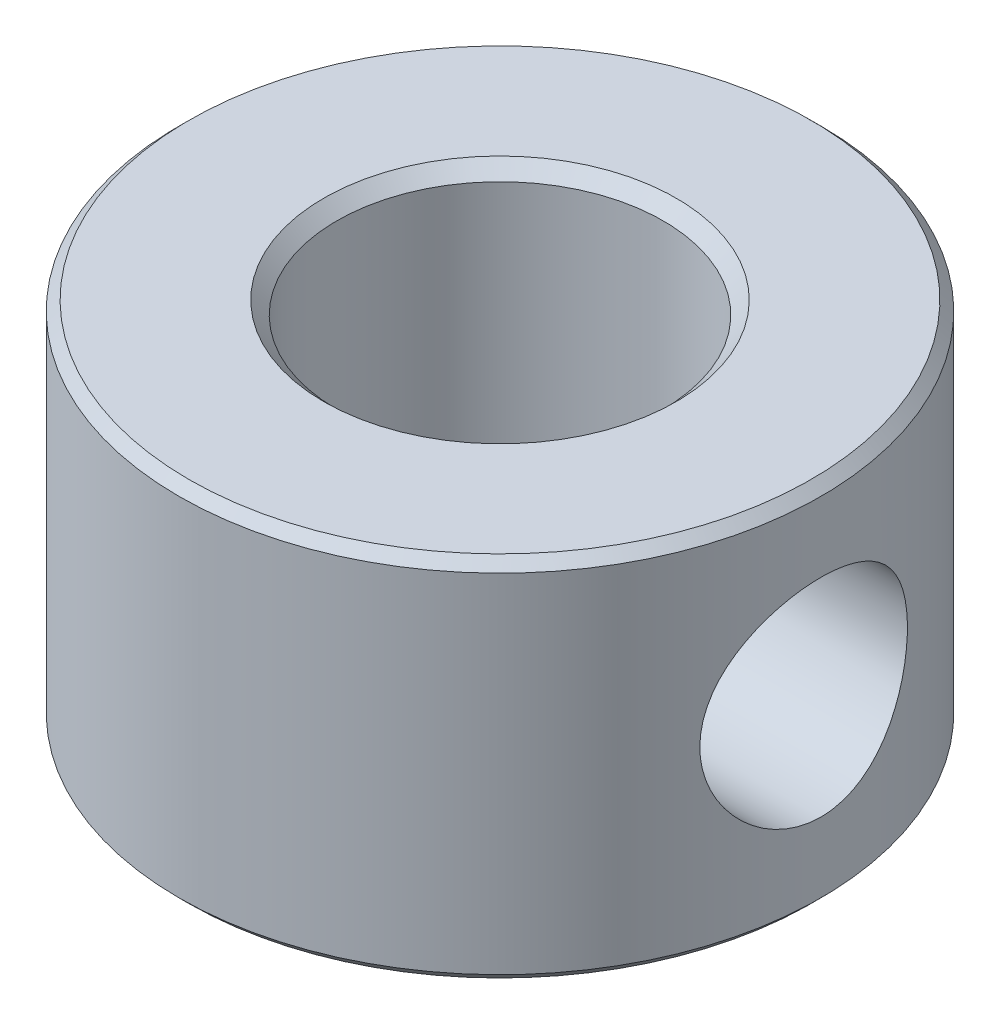
ISO-10303-21;
HEADER;
FILE_DESCRIPTION(('STEP AP214'),'2;1');
FILE_NAME('part.step','',(''),(''),'','','');
FILE_SCHEMA(('AUTOMOTIVE_DESIGN { 1 0 10303 214 1 1 1 1 }'));
ENDSEC;
DATA;
#1=APPLICATION_CONTEXT('core data for automotive mechanical design processes');
#2=APPLICATION_PROTOCOL_DEFINITION('international standard','automotive_design',2000,#1);
#3=PRODUCT_CONTEXT('',#1,'mechanical');
#4=PRODUCT('Part','Part','',(#3));
#5=PRODUCT_RELATED_PRODUCT_CATEGORY('part','',(#4));
#6=PRODUCT_DEFINITION_FORMATION('','',#4);
#7=PRODUCT_DEFINITION_CONTEXT('part definition',#1,'design');
#8=PRODUCT_DEFINITION('design','',#6,#7);
#9=PRODUCT_DEFINITION_SHAPE('','',#8);
#10=(LENGTH_UNIT() NAMED_UNIT(*) SI_UNIT(.MILLI.,.METRE.));
#11=(NAMED_UNIT(*) PLANE_ANGLE_UNIT() SI_UNIT($,.RADIAN.));
#12=(NAMED_UNIT(*) SI_UNIT($,.STERADIAN.) SOLID_ANGLE_UNIT());
#13=UNCERTAINTY_MEASURE_WITH_UNIT(LENGTH_MEASURE(1.E-05),#10,'distance_accuracy_value','');
#14=(GEOMETRIC_REPRESENTATION_CONTEXT(3) GLOBAL_UNCERTAINTY_ASSIGNED_CONTEXT((#13)) GLOBAL_UNIT_ASSIGNED_CONTEXT((#10,
#11,#12)) REPRESENTATION_CONTEXT('',''));
#15=CARTESIAN_POINT('',(0.,0.,0.));
#16=DIRECTION('',(0.,0.,1.));
#17=DIRECTION('',(1.,0.,0.));
#18=AXIS2_PLACEMENT_3D('',#15,#16,#17);
#19=CARTESIAN_POINT('',(0.,7.14502,0.));
#20=DIRECTION('',(0.,1.,0.));
#21=DIRECTION('',(0.,0.,1.));
#22=AXIS2_PLACEMENT_3D('',#19,#20,#21);
#23=PLANE('',#22);
#24=CARTESIAN_POINT('',(0.,7.14502,0.));
#25=DIRECTION('',(0.,1.,0.));
#26=DIRECTION('',(0.,0.,1.));
#27=AXIS2_PLACEMENT_3D('',#24,#25,#26);
#28=CIRCLE('',#27,3.429);
#29=CARTESIAN_POINT('',(0.,7.14502,3.429));
#30=VERTEX_POINT('',#29);
#31=EDGE_CURVE('E50',#30,#30,#28,.F.);
#32=ORIENTED_EDGE('',*,*,#31,.T.);
#33=EDGE_LOOP('',(#32));
#34=FACE_BOUND('',#33,.T.);
#35=CARTESIAN_POINT('',(0.,7.14502,0.));
#36=DIRECTION('',(0.,1.,0.));
#37=DIRECTION('',(0.,0.,1.));
#38=AXIS2_PLACEMENT_3D('',#35,#36,#37);
#39=CIRCLE('',#38,6.05155000000001);
#40=CARTESIAN_POINT('',(0.,7.14502,6.05155000000001));
#41=VERTEX_POINT('',#40);
#42=EDGE_CURVE('E62',#41,#41,#39,.T.);
#43=ORIENTED_EDGE('',*,*,#42,.T.);
#44=EDGE_LOOP('',(#43));
#45=FACE_BOUND('',#44,.T.);
#46=ADVANCED_FACE('F34',(#34,#45),#23,.T.);
#47=CARTESIAN_POINT('',(0.,0.,0.));
#48=DIRECTION('',(0.,1.,0.));
#49=DIRECTION('',(0.,0.,1.));
#50=AXIS2_PLACEMENT_3D('',#47,#48,#49);
#51=PLANE('',#50);
#52=CARTESIAN_POINT('',(0.,0.,0.));
#53=DIRECTION('',(0.,1.,0.));
#54=DIRECTION('',(0.,0.,1.));
#55=AXIS2_PLACEMENT_3D('',#52,#53,#54);
#56=CIRCLE('',#55,3.42899999999999);
#57=CARTESIAN_POINT('',(0.,0.,3.42899999999999));
#58=VERTEX_POINT('',#57);
#59=EDGE_CURVE('E46',#58,#58,#56,.T.);
#60=ORIENTED_EDGE('',*,*,#59,.T.);
#61=EDGE_LOOP('',(#60));
#62=FACE_BOUND('',#61,.T.);
#63=CARTESIAN_POINT('',(0.,0.,0.));
#64=DIRECTION('',(0.,1.,0.));
#65=DIRECTION('',(0.,0.,1.));
#66=AXIS2_PLACEMENT_3D('',#63,#64,#65);
#67=CIRCLE('',#66,6.05154999999999);
#68=CARTESIAN_POINT('',(0.,0.,6.05154999999999));
#69=VERTEX_POINT('',#68);
#70=EDGE_CURVE('E65',#69,#69,#67,.F.);
#71=ORIENTED_EDGE('',*,*,#70,.T.);
#72=EDGE_LOOP('',(#71));
#73=FACE_BOUND('',#72,.T.);
#74=ADVANCED_FACE('F95',(#62,#73),#51,.F.);
#75=CARTESIAN_POINT('',(0.,7.14502,0.));
#76=DIRECTION('',(0.,-1.,0.));
#77=DIRECTION('',(0.,0.,-1.));
#78=AXIS2_PLACEMENT_3D('',#75,#76,#77);
#79=CYLINDRICAL_SURFACE('',#78,6.24205);
#80=CARTESIAN_POINT('',(6.24205,1.55321000000001,0.));
#81=CARTESIAN_POINT('',(6.24204987098175,1.55321010305949,0.110361607787844));
#82=CARTESIAN_POINT('',(6.2390958556555,1.56228707806343,0.220725250071233));
#83=CARTESIAN_POINT('',(6.22760191806045,1.59825170997894,0.43821286009597));
#84=CARTESIAN_POINT('',(6.21906109093358,1.62514225204233,0.545336300102706));
#85=CARTESIAN_POINT('',(6.19732396104721,1.69572360172864,0.753176327739559));
#86=CARTESIAN_POINT('',(6.18413516935356,1.73938731425837,0.853902944457347));
#87=CARTESIAN_POINT('',(6.15445572442031,1.84215651905202,1.04660424357037));
#88=CARTESIAN_POINT('',(6.13796448104393,1.90126477177849,1.13857735740495));
#89=CARTESIAN_POINT('',(6.10281698787693,2.03528655688525,1.31418213372415));
#90=CARTESIAN_POINT('',(6.08411109688674,2.11061619914058,1.39748623675391));
#91=CARTESIAN_POINT('',(6.04692251587769,2.27405714507101,1.55052602599469));
#92=CARTESIAN_POINT('',(6.02843987198791,2.36217104299494,1.62025895152977));
#93=CARTESIAN_POINT('',(5.99325079912104,2.55157379256864,1.74600156347859));
#94=CARTESIAN_POINT('',(5.97660524073269,2.65315242483614,1.80159342593578));
#95=CARTESIAN_POINT('',(5.94772589089101,2.86484265778281,1.89476693037713));
#96=CARTESIAN_POINT('',(5.93549084231211,2.97495181612178,1.93235370534908));
#97=CARTESIAN_POINT('',(5.91733885565084,3.1968659604572,1.98723572400281));
#98=CARTESIAN_POINT('',(5.91123225336117,3.30850390708536,2.00514185100346));
#99=CARTESIAN_POINT('',(5.90546653592937,3.53335370137909,2.02206344905887));
#100=CARTESIAN_POINT('',(5.90580556391969,3.64656508637492,2.02108436059574));
#101=CARTESIAN_POINT('',(5.91272601191444,3.86621428099793,2.00073929260716));
#102=CARTESIAN_POINT('',(5.91904017316428,3.9727348633256,1.98216048494432));
#103=CARTESIAN_POINT('',(5.9367636319365,4.18105715713211,1.92842373887578));
#104=CARTESIAN_POINT('',(5.94817350644599,4.28285833279176,1.89326392297893));
#105=CARTESIAN_POINT('',(5.9750000638336,4.48068193047347,1.80682863570085));
#106=CARTESIAN_POINT('',(5.99047575426177,4.57659119538614,1.75531328608411));
#107=CARTESIAN_POINT('',(6.02366439491423,4.75865725871121,1.63779580184213));
#108=CARTESIAN_POINT('',(6.04137796011666,4.8448113639737,1.57178968139509));
#109=CARTESIAN_POINT('',(6.07810787944163,5.00935790224419,1.42334436695478));
#110=CARTESIAN_POINT('',(6.09714554601541,5.087163384294,1.34025857265405));
#111=CARTESIAN_POINT('',(6.13361656052184,5.22788482665606,1.16198264310722));
#112=CARTESIAN_POINT('',(6.15104977188977,5.29079952023982,1.06679147914057));
#113=CARTESIAN_POINT('',(6.1825538765581,5.40038974788208,0.86581670750765));
#114=CARTESIAN_POINT('',(6.19659358003453,5.44691631679446,0.759946647618174));
#115=CARTESIAN_POINT('',(6.21950303570453,5.52132121703144,0.54132106343912));
#116=CARTESIAN_POINT('',(6.22837447493545,5.54920563401166,0.428567799274002));
#117=CARTESIAN_POINT('',(6.23967218609234,5.58451406338999,0.204351750125743));
#118=CARTESIAN_POINT('',(6.24234836669601,5.59273188950391,0.0930263876335407));
#119=CARTESIAN_POINT('',(6.24169855806503,5.59072404152825,-0.129429578308453));
#120=CARTESIAN_POINT('',(6.23837351593071,5.58050127769389,-0.24056020971978));
#121=CARTESIAN_POINT('',(6.2262595122325,5.54253510603896,-0.456350285277136));
#122=CARTESIAN_POINT('',(6.21762037114401,5.51527179391414,-0.561103426418709));
#123=CARTESIAN_POINT('',(6.19590024482501,5.44459174553279,-0.76451293236808));
#124=CARTESIAN_POINT('',(6.18281870057258,5.40117297624445,-0.863168528026936));
#125=CARTESIAN_POINT('',(6.15313628841962,5.29818576054547,-1.05437511503154));
#126=CARTESIAN_POINT('',(6.13645440765245,5.23823482283847,-1.14670716032191));
#127=CARTESIAN_POINT('',(6.10147076745199,5.10433888852933,-1.3202626868448));
#128=CARTESIAN_POINT('',(6.08316854016024,5.03038984305611,-1.40148294231827));
#129=CARTESIAN_POINT('',(6.04602084377535,4.86686240241354,-1.5541099164561));
#130=CARTESIAN_POINT('',(6.02718549622144,4.77675194292228,-1.62495036869059));
#131=CARTESIAN_POINT('',(5.99190961061176,4.5855150744732,-1.75056523990495));
#132=CARTESIAN_POINT('',(5.97546906232882,4.48438871256282,-1.80533972749672));
#133=CARTESIAN_POINT('',(5.94701677031808,4.27407660655124,-1.89696824379646));
#134=CARTESIAN_POINT('',(5.93499183150095,4.16491606411411,-1.93387577102216));
#135=CARTESIAN_POINT('',(5.91687128549093,3.94145533762214,-1.9886353446116));
#136=CARTESIAN_POINT('',(5.91077320968064,3.82715731416885,-2.00649532483426));
#137=CARTESIAN_POINT('',(5.90546645058777,3.60262049145591,-2.02205698074767));
#138=CARTESIAN_POINT('',(5.90593835750382,3.49245325204258,-2.02069320679469));
#139=CARTESIAN_POINT('',(5.9129352562404,3.27400282004023,-2.00012503239849));
#140=CARTESIAN_POINT('',(5.91945992647479,3.1657195276676,-1.98092157978566));
#141=CARTESIAN_POINT('',(5.93759622909786,2.95591379377526,-1.92586390591926));
#142=CARTESIAN_POINT('',(5.94912038733202,2.85430823093395,-1.89029539712448));
#143=CARTESIAN_POINT('',(5.97592952606043,2.65842730062317,-1.80374539537514));
#144=CARTESIAN_POINT('',(5.99121530918817,2.56415350322009,-1.75276061245461));
#145=CARTESIAN_POINT('',(6.02461663149163,2.38137369030562,-1.63435334289241));
#146=CARTESIAN_POINT('',(6.04282328770591,2.29326947134838,-1.56633643673177));
#147=CARTESIAN_POINT('',(6.07961581104668,2.12942305747808,-1.41682013012052));
#148=CARTESIAN_POINT('',(6.0982017813197,2.05368427686617,-1.33531701837245));
#149=CARTESIAN_POINT('',(6.13445933896264,1.9139875328968,-1.15762581730249));
#150=CARTESIAN_POINT('',(6.15207416705775,1.85054995408412,-1.06101566124169));
#151=CARTESIAN_POINT('',(6.18366159886644,1.74089240857486,-0.85793612079198));
#152=CARTESIAN_POINT('',(6.19763537745447,1.69466688591308,-0.751469931761009));
#153=CARTESIAN_POINT('',(6.21962033037372,1.62337240261327,-0.538709548099766));
#154=CARTESIAN_POINT('',(6.22795509697885,1.59714160143855,-0.43283792917931));
#155=CARTESIAN_POINT('',(6.23916934417463,1.56206242459734,-0.217977701178107));
#156=CARTESIAN_POINT('',(6.24205012741459,1.55320989822154,-0.108989842705757));
#157=CARTESIAN_POINT('',(6.24205,1.55321000000001,0.));
#158=B_SPLINE_CURVE_WITH_KNOTS('',3,(#80,#81,#82,#83,#84,#85,#86,#87,#88,#89,#90,#91,#92,#93,
#94,#95,#96,#97,#98,#99,#100,#101,#102,#103,#104,#105,#106,#107,#108,#109,#110,#111,#112,#113,
#114,#115,#116,#117,#118,#119,#120,#121,#122,#123,#124,#125,#126,#127,#128,#129,#130,#131,#132,
#133,#134,#135,#136,#137,#138,#139,#140,#141,#142,#143,#144,#145,#146,#147,#148,#149,#150,#151,
#152,#153,#154,#155,#156,#157),.UNSPECIFIED.,.T.,.F.,(4,2,2,2,2,2,2,2,2,2,2,2,2,2,2,2,2,2,2,2,2,
2,2,2,2,2,2,2,2,2,2,2,2,2,2,2,2,2,4),(0.,0.330683969748947,0.661421511406924,0.991627016821767,
1.32189158156642,1.66193363828124,2.0020447948915,2.35127007678386,2.70039574030425,
3.03834853982958,3.37620398284384,3.69962812460597,4.02308889694029,4.35153173210665,
4.68006502198354,5.02469184077873,5.36934796573399,5.71706067156383,6.06465981247974,
6.39797274878697,6.73123308694764,7.05550303184148,7.37981379725744,7.71236907007649,
8.04502067995674,8.39185943616832,8.7386967111361,9.08448893725422,9.43013707450293,
9.75904221588357,10.0879298833811,10.4112815982195,10.7347023678671,11.0715467782565,
11.4084840402093,11.7575142248891,12.1064316465071,12.4330833320422,12.7596569890474),.UNSPECIFIED.);
#159=CARTESIAN_POINT('',(6.24205,1.55321000000001,0.));
#160=VERTEX_POINT('',#159);
#161=EDGE_CURVE('E10',#160,#160,#158,.T.);
#162=ORIENTED_EDGE('',*,*,#161,.T.);
#163=EDGE_LOOP('',(#162));
#164=FACE_BOUND('',#163,.T.);
#165=CARTESIAN_POINT('',(0.,0.190500000000006,0.));
#166=DIRECTION('',(0.,1.,0.));
#167=DIRECTION('',(0.,0.,1.));
#168=AXIS2_PLACEMENT_3D('',#165,#166,#167);
#169=CIRCLE('',#168,6.24205);
#170=CARTESIAN_POINT('',(0.,0.190500000000006,6.24205));
#171=VERTEX_POINT('',#170);
#172=EDGE_CURVE('E68',#171,#171,#169,.T.);
#173=ORIENTED_EDGE('',*,*,#172,.T.);
#174=EDGE_LOOP('',(#173));
#175=FACE_BOUND('',#174,.T.);
#176=CARTESIAN_POINT('',(0.,6.95452000000001,0.));
#177=DIRECTION('',(0.,1.,0.));
#178=DIRECTION('',(0.,0.,1.));
#179=AXIS2_PLACEMENT_3D('',#176,#177,#178);
#180=CIRCLE('',#179,6.24205);
#181=CARTESIAN_POINT('',(0.,6.95452000000001,6.24205));
#182=VERTEX_POINT('',#181);
#183=EDGE_CURVE('E71',#182,#182,#180,.F.);
#184=ORIENTED_EDGE('',*,*,#183,.T.);
#185=EDGE_LOOP('',(#184));
#186=FACE_BOUND('',#185,.T.);
#187=ADVANCED_FACE('F100',(#164,#175,#186),#79,.T.);
#188=CARTESIAN_POINT('',(0.,7.14502,0.));
#189=DIRECTION('',(0.,-1.,0.));
#190=DIRECTION('',(0.,0.,-1.));
#191=AXIS2_PLACEMENT_3D('',#188,#189,#190);
#192=CYLINDRICAL_SURFACE('',#191,3.175);
#193=CARTESIAN_POINT('',(2.45011275454825,3.57251000000001,2.0193));
#194=CARTESIAN_POINT('',(2.45012817951552,3.67245127069754,2.01929051569736));
#195=CARTESIAN_POINT('',(2.45634010720797,3.77248232992501,2.0118162399891));
#196=CARTESIAN_POINT('',(2.48006385016957,3.96908968147833,1.98248167673376));
#197=CARTESIAN_POINT('',(2.49759801227128,4.06565874208905,1.96059293748518));
#198=CARTESIAN_POINT('',(2.54096978697851,4.25194627589823,1.9040331603516));
#199=CARTESIAN_POINT('',(2.56673468951973,4.34171652404969,1.86947367457507));
#200=CARTESIAN_POINT('',(2.62353964875392,4.51407455142343,1.78888009345359));
#201=CARTESIAN_POINT('',(2.6545807662544,4.5966608812278,1.74284368975069));
#202=CARTESIAN_POINT('',(2.72365220953031,4.76495151025591,1.63312725242593));
#203=CARTESIAN_POINT('',(2.76205343085876,4.84948324500192,1.56788172310624));
#204=CARTESIAN_POINT('',(2.83851915466699,5.0074001775689,1.42479045231801));
#205=CARTESIAN_POINT('',(2.87658333731988,5.08077567508321,1.34693386567764));
#206=CARTESIAN_POINT('',(2.95378200389087,5.22351661538209,1.16891001207364));
#207=CARTESIAN_POINT('',(2.99244190742994,5.29119834305825,1.06716606271611));
#208=CARTESIAN_POINT('',(3.06097746101505,5.40792857889046,0.850805271225741));
#209=CARTESIAN_POINT('',(3.09086204386166,5.45699605031168,0.736201684957571));
#210=CARTESIAN_POINT('',(3.13566626418313,5.52956734525047,0.50999490435427));
#211=CARTESIAN_POINT('',(3.15182273437589,5.55520558748186,0.399328091275864));
#212=CARTESIAN_POINT('',(3.17222196724828,5.58748014691784,0.174221138396404));
#213=CARTESIAN_POINT('',(3.17647787280316,5.59413742668433,0.0597853025568782));
#214=CARTESIAN_POINT('',(3.17286513938984,5.58844994541019,-0.152424127581291));
#215=CARTESIAN_POINT('',(3.16659762255069,5.57861476842587,-0.250305470554215));
#216=CARTESIAN_POINT('',(3.14547384128328,5.54510302412573,-0.442698018208736));
#217=CARTESIAN_POINT('',(3.13061693122206,5.52142541632403,-0.537208968983375));
#218=CARTESIAN_POINT('',(3.09356053401838,5.46132504253611,-0.720612526879305));
#219=CARTESIAN_POINT('',(3.07135380901376,5.42488971109532,-0.809499492488899));
#220=CARTESIAN_POINT('',(3.02129545312328,5.3406502778234,-0.979948739206574));
#221=CARTESIAN_POINT('',(2.99344261064515,5.29284373547797,-1.06150944275226));
#222=CARTESIAN_POINT('',(2.93020696894433,5.1804560908818,-1.22606234754406));
#223=CARTESIAN_POINT('',(2.89431735966664,5.11451822513684,-1.307931323684));
#224=CARTESIAN_POINT('',(2.82059026986525,4.97124303530304,-1.46016022959231));
#225=CARTESIAN_POINT('',(2.78274994751954,4.89388875571949,-1.53050270668809));
#226=CARTESIAN_POINT('',(2.70316998021409,4.71754891610958,-1.66750948099941));
#227=CARTESIAN_POINT('',(2.66160715287759,4.61705168042349,-1.73234677283066));
#228=CARTESIAN_POINT('',(2.58550168350825,4.40411899617822,-1.84401294040444));
#229=CARTESIAN_POINT('',(2.55094631600009,4.29170576286593,-1.89087460028104));
#230=CARTESIAN_POINT('',(2.50255370083124,4.08887060127734,-1.95422417089593));
#231=CARTESIAN_POINT('',(2.48564302359113,4.00068038933684,-1.97549340596572));
#232=CARTESIAN_POINT('',(2.46108567735713,3.82103371563983,-2.00601072185795));
#233=CARTESIAN_POINT('',(2.45342548274737,3.72958222444307,-2.01527635522343));
#234=CARTESIAN_POINT('',(2.44853180042155,3.54572667144574,-2.02122148552108));
#235=CARTESIAN_POINT('',(2.45132711866525,3.45332067847948,-2.01786621047329));
#236=CARTESIAN_POINT('',(2.46695474139764,3.27064534005662,-1.99872482253261));
#237=CARTESIAN_POINT('',(2.47979543499971,3.18037784545299,-1.9829283196228));
#238=CARTESIAN_POINT('',(2.51323380479194,3.00644908196719,-1.94035603763407));
#239=CARTESIAN_POINT('',(2.53363649039046,2.92268087309288,-1.9138548599113));
#240=CARTESIAN_POINT('',(2.57995729521188,2.76061707475904,-1.8509371143313));
#241=CARTESIAN_POINT('',(2.60587725559257,2.68232332378447,-1.81451723538921));
#242=CARTESIAN_POINT('',(2.66637185156354,2.51729481532054,-1.72468862869318));
#243=CARTESIAN_POINT('',(2.70165014338981,2.43186645675553,-1.66935511652756));
#244=CARTESIAN_POINT('',(2.77361921697772,2.27053926072513,-1.54684224267733));
#245=CARTESIAN_POINT('',(2.81031162521157,2.19465185189079,-1.47964890187628));
#246=CARTESIAN_POINT('',(2.88849831537442,2.04101442417589,-1.32146957597982));
#247=CARTESIAN_POINT('',(2.92970866402265,1.96526420866532,-1.22837765550165));
#248=CARTESIAN_POINT('',(3.0057169760996,1.83056670958564,-1.02843925094223));
#249=CARTESIAN_POINT('',(3.04052210010589,1.77160062174494,-0.921608355915268));
#250=CARTESIAN_POINT('',(3.09386715213231,1.68308226245439,-0.719216299701137));
#251=CARTESIAN_POINT('',(3.11426889307068,1.65000343239507,-0.625687670231277));
#252=CARTESIAN_POINT('',(3.14677961976787,1.59777158788784,-0.433449506453149));
#253=CARTESIAN_POINT('',(3.15889519725594,1.57860750336512,-0.334744157744077));
#254=CARTESIAN_POINT('',(3.17373957805951,1.5551716455388,-0.134549858045074));
#255=CARTESIAN_POINT('',(3.1764391602035,1.5509462316746,-0.0330532251289087));
#256=CARTESIAN_POINT('',(3.17210070452945,1.55776996732009,0.169220717606883));
#257=CARTESIAN_POINT('',(3.16506174909833,1.56882055621006,0.269997958742477));
#258=CARTESIAN_POINT('',(3.14250337260816,1.60465457582786,0.462903169338655));
#259=CARTESIAN_POINT('',(3.12741313735222,1.62874382787445,0.555213410179458));
#260=CARTESIAN_POINT('',(3.09028356911829,1.68906540013466,0.734262324128188));
#261=CARTESIAN_POINT('',(3.06824310438062,1.72529969808064,0.821000087055458));
#262=CARTESIAN_POINT('',(3.01687781461152,1.81188247564594,0.993896475754064));
#263=CARTESIAN_POINT('',(2.98711895257937,1.86311130435253,1.07948239570686));
#264=CARTESIAN_POINT('',(2.92359589755363,1.9767097608168,1.24128256073288));
#265=CARTESIAN_POINT('',(2.88982844010591,2.03908848984223,1.31748906326209));
#266=CARTESIAN_POINT('',(2.81541804007874,2.18399577966154,1.47048578378875));
#267=CARTESIAN_POINT('',(2.77450861601171,2.26814535064112,1.54561455035015));
#268=CARTESIAN_POINT('',(2.69448679509777,2.44835642528027,1.681239830294));
#269=CARTESIAN_POINT('',(2.65537483579392,2.54442080844168,1.7417327961185));
#270=CARTESIAN_POINT('',(2.58891897326561,2.73228299516957,1.83876550837132));
#271=CARTESIAN_POINT('',(2.56069019061929,2.82261791563855,1.87752281278317));
#272=CARTESIAN_POINT('',(2.51228784962043,3.00981054967502,1.94182185539048));
#273=CARTESIAN_POINT('',(2.49209287945083,3.10665010978251,1.96739877665449));
#274=CARTESIAN_POINT('',(2.46853356270056,3.26567120028778,1.99678820017446));
#275=CARTESIAN_POINT('',(2.4616738393758,3.32651506264098,2.00520384926547));
#276=CARTESIAN_POINT('',(2.45245846542436,3.44906447596038,2.01646293280568));
#277=CARTESIAN_POINT('',(2.45010322559336,3.51077010500032,2.01930585903946));
#278=CARTESIAN_POINT('',(2.45011275454825,3.57251000000001,2.0193));
#279=B_SPLINE_CURVE_WITH_KNOTS('',3,(#193,#194,#195,#196,#197,#198,#199,#200,#201,#202,#203,
#204,#205,#206,#207,#208,#209,#210,#211,#212,#213,#214,#215,#216,#217,#218,#219,#220,#221,#222,
#223,#224,#225,#226,#227,#228,#229,#230,#231,#232,#233,#234,#235,#236,#237,#238,#239,#240,#241,
#242,#243,#244,#245,#246,#247,#248,#249,#250,#251,#252,#253,#254,#255,#256,#257,#258,#259,#260,
#261,#262,#263,#264,#265,#266,#267,#268,#269,#270,#271,#272,#273,#274,#275,#276,#277,#278),
.UNSPECIFIED.,.T.,.F.,(4,2,2,2,2,2,2,2,2,2,2,2,2,2,2,2,2,2,2,2,2,2,2,2,2,2,2,2,2,2,2,2,2,2,2,2,
2,2,2,2,2,2,4),(0.,0.299545346163704,0.599683723262751,0.897240786031996,1.19485774494705,
1.53399780499747,1.87343108015559,2.25583678812835,2.63785186753818,2.9799751474998,
3.32172044011375,3.61602438944013,3.91035046338392,4.20496724691206,4.49964731888726,
4.83159144770302,5.16403363102358,5.54206146658147,5.91939653552262,6.19510071677628,
6.4704012864861,6.74646089414035,7.02275129165826,7.29236365357904,7.56206612870598,
7.8840575585005,8.20643108372259,8.58524226804171,8.96362736164553,9.2661764004181,
9.56848447745555,9.87172989295247,10.175003883675,10.4635252097641,10.7520935422966,
11.0631665349709,11.3744946147801,11.7329995987663,12.0915913935742,12.3972580961101,
12.7021045844747,12.887135370411,13.0721830298085),.UNSPECIFIED.);
#280=CARTESIAN_POINT('',(2.45011275454825,3.57251000000001,2.0193));
#281=VERTEX_POINT('',#280);
#282=EDGE_CURVE('E74',#281,#281,#279,.T.);
#283=ORIENTED_EDGE('',*,*,#282,.F.);
#284=EDGE_LOOP('',(#283));
#285=FACE_BOUND('',#284,.T.);
#286=CARTESIAN_POINT('',(0.,6.89102,0.));
#287=DIRECTION('',(0.,1.,0.));
#288=DIRECTION('',(0.,0.,1.));
#289=AXIS2_PLACEMENT_3D('',#286,#287,#288);
#290=CIRCLE('',#289,3.175);
#291=CARTESIAN_POINT('',(0.,6.89102,3.175));
#292=VERTEX_POINT('',#291);
#293=EDGE_CURVE('E54',#292,#292,#290,.T.);
#294=ORIENTED_EDGE('',*,*,#293,.T.);
#295=EDGE_LOOP('',(#294));
#296=FACE_BOUND('',#295,.T.);
#297=CARTESIAN_POINT('',(0.,0.253999999999994,0.));
#298=DIRECTION('',(0.,1.,0.));
#299=DIRECTION('',(0.,0.,1.));
#300=AXIS2_PLACEMENT_3D('',#297,#298,#299);
#301=CIRCLE('',#300,3.175);
#302=CARTESIAN_POINT('',(0.,0.253999999999994,3.175));
#303=VERTEX_POINT('',#302);
#304=EDGE_CURVE('E59',#303,#303,#301,.F.);
#305=ORIENTED_EDGE('',*,*,#304,.T.);
#306=EDGE_LOOP('',(#305));
#307=FACE_BOUND('',#306,.T.);
#308=ADVANCED_FACE('F80',(#285,#296,#307),#192,.F.);
#309=CARTESIAN_POINT('',(0.,0.190500000000006,0.));
#310=DIRECTION('',(0.,1.,0.));
#311=DIRECTION('',(0.,0.,1.));
#312=AXIS2_PLACEMENT_3D('',#309,#310,#311);
#313=CONICAL_SURFACE('',#312,6.24205,0.785398163397453);
#314=ORIENTED_EDGE('',*,*,#70,.F.);
#315=EDGE_LOOP('',(#314));
#316=FACE_BOUND('',#315,.T.);
#317=ORIENTED_EDGE('',*,*,#172,.F.);
#318=EDGE_LOOP('',(#317));
#319=FACE_BOUND('',#318,.T.);
#320=ADVANCED_FACE('F106',(#316,#319),#313,.T.);
#321=CARTESIAN_POINT('',(0.,7.14502,0.));
#322=DIRECTION('',(0.,-1.,0.));
#323=DIRECTION('',(0.,0.,-1.));
#324=AXIS2_PLACEMENT_3D('',#321,#322,#323);
#325=CONICAL_SURFACE('',#324,6.05155000000001,0.785398163397455);
#326=ORIENTED_EDGE('',*,*,#183,.F.);
#327=EDGE_LOOP('',(#326));
#328=FACE_BOUND('',#327,.T.);
#329=ORIENTED_EDGE('',*,*,#42,.F.);
#330=EDGE_LOOP('',(#329));
#331=FACE_BOUND('',#330,.T.);
#332=ADVANCED_FACE('F109',(#328,#331),#325,.T.);
#333=CARTESIAN_POINT('',(0.,6.89102,0.));
#334=DIRECTION('',(0.,1.,0.));
#335=DIRECTION('',(0.,0.,1.));
#336=AXIS2_PLACEMENT_3D('',#333,#334,#335);
#337=CONICAL_SURFACE('',#336,3.175,0.785398163397447);
#338=ORIENTED_EDGE('',*,*,#31,.F.);
#339=EDGE_LOOP('',(#338));
#340=FACE_BOUND('',#339,.T.);
#341=ORIENTED_EDGE('',*,*,#293,.F.);
#342=EDGE_LOOP('',(#341));
#343=FACE_BOUND('',#342,.T.);
#344=ADVANCED_FACE('F91',(#340,#343),#337,.F.);
#345=CARTESIAN_POINT('',(0.,0.,0.));
#346=DIRECTION('',(0.,-1.,0.));
#347=DIRECTION('',(0.,0.,-1.));
#348=AXIS2_PLACEMENT_3D('',#345,#346,#347);
#349=CONICAL_SURFACE('',#348,3.42899999999999,0.785398163397446);
#350=ORIENTED_EDGE('',*,*,#304,.F.);
#351=EDGE_LOOP('',(#350));
#352=FACE_BOUND('',#351,.T.);
#353=ORIENTED_EDGE('',*,*,#59,.F.);
#354=EDGE_LOOP('',(#353));
#355=FACE_BOUND('',#354,.T.);
#356=ADVANCED_FACE('F36',(#352,#355),#349,.F.);
#357=CARTESIAN_POINT('',(0.,3.57251000000001,0.));
#358=DIRECTION('',(-1.,0.,0.));
#359=DIRECTION('',(0.,0.,1.));
#360=AXIS2_PLACEMENT_3D('',#357,#358,#359);
#361=CYLINDRICAL_SURFACE('',#360,2.0193);
#362=ORIENTED_EDGE('',*,*,#282,.T.);
#363=EDGE_LOOP('',(#362));
#364=FACE_BOUND('',#363,.T.);
#365=ORIENTED_EDGE('',*,*,#161,.F.);
#366=EDGE_LOOP('',(#365));
#367=FACE_BOUND('',#366,.T.);
#368=ADVANCED_FACE('F83',(#364,#367),#361,.F.);
#369=CLOSED_SHELL('',(#46,#74,#187,#308,#320,#332,#344,#356,#368));
#370=MANIFOLD_SOLID_BREP('B2',#369);
#371=ADVANCED_BREP_SHAPE_REPRESENTATION('',(#18,#370),#14);
#372=SHAPE_DEFINITION_REPRESENTATION(#9,#371);
ENDSEC;
END-ISO-10303-21;
